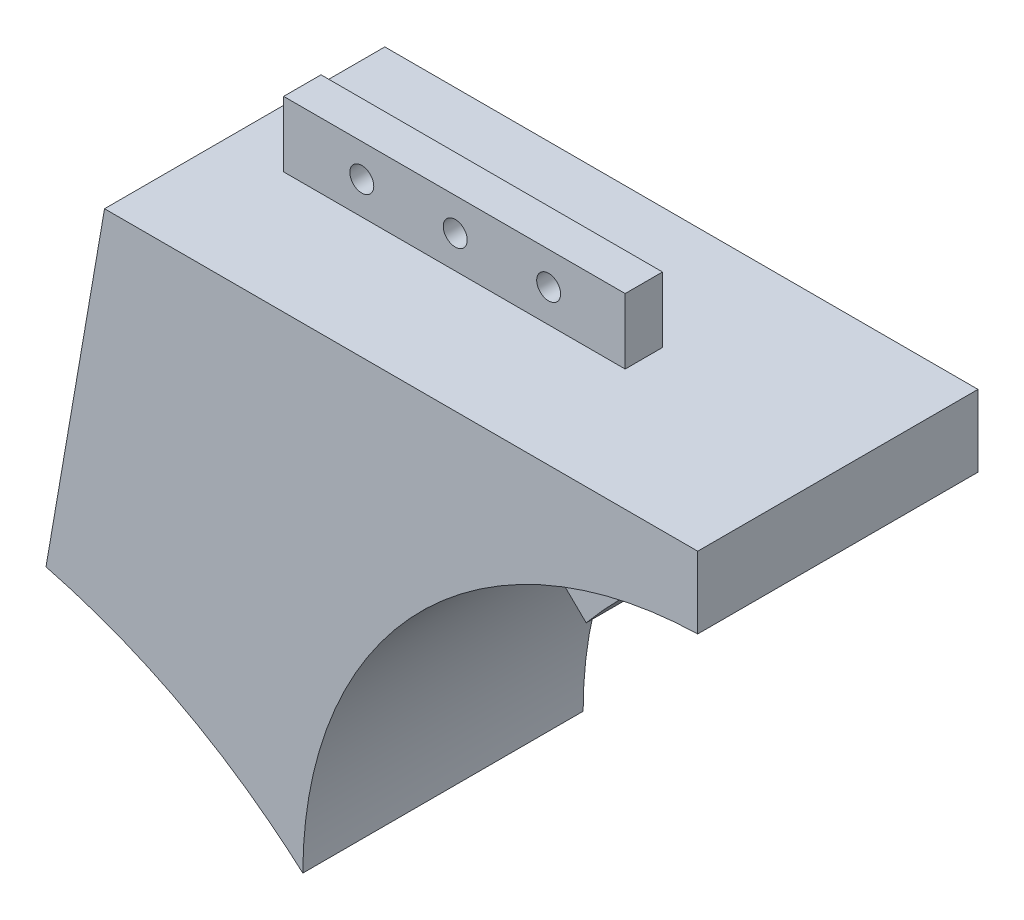
ISO-10303-21;
HEADER;
FILE_DESCRIPTION(('STEP AP214'),'2;1');
FILE_NAME('part.step','',(''),(''),'','','');
FILE_SCHEMA(('AUTOMOTIVE_DESIGN { 1 0 10303 214 1 1 1 1 }'));
ENDSEC;
DATA;
#1=APPLICATION_CONTEXT('core data for automotive mechanical design processes');
#2=APPLICATION_PROTOCOL_DEFINITION('international standard','automotive_design',2000,#1);
#3=PRODUCT_CONTEXT('',#1,'mechanical');
#4=PRODUCT('Part','Part','',(#3));
#5=PRODUCT_RELATED_PRODUCT_CATEGORY('part','',(#4));
#6=PRODUCT_DEFINITION_FORMATION('','',#4);
#7=PRODUCT_DEFINITION_CONTEXT('part definition',#1,'design');
#8=PRODUCT_DEFINITION('design','',#6,#7);
#9=PRODUCT_DEFINITION_SHAPE('','',#8);
#10=(LENGTH_UNIT() NAMED_UNIT(*) SI_UNIT(.MILLI.,.METRE.));
#11=(NAMED_UNIT(*) PLANE_ANGLE_UNIT() SI_UNIT($,.RADIAN.));
#12=(NAMED_UNIT(*) SI_UNIT($,.STERADIAN.) SOLID_ANGLE_UNIT());
#13=UNCERTAINTY_MEASURE_WITH_UNIT(LENGTH_MEASURE(1.E-05),#10,'distance_accuracy_value','');
#14=(GEOMETRIC_REPRESENTATION_CONTEXT(3) GLOBAL_UNCERTAINTY_ASSIGNED_CONTEXT((#13)) GLOBAL_UNIT_ASSIGNED_CONTEXT((#10,
#11,#12)) REPRESENTATION_CONTEXT('',''));
#15=CARTESIAN_POINT('',(0.,0.,0.));
#16=DIRECTION('',(0.,0.,1.));
#17=DIRECTION('',(1.,0.,0.));
#18=AXIS2_PLACEMENT_3D('',#15,#16,#17);
#19=CARTESIAN_POINT('',(0.,43.8748420001809,30.));
#20=DIRECTION('',(0.,-1.,0.));
#21=DIRECTION('',(0.,0.,-1.));
#22=AXIS2_PLACEMENT_3D('',#19,#20,#21);
#23=PLANE('',#22);
#24=DIRECTION('',(1.,0.,0.));
#25=VECTOR('',#24,1.);
#26=CARTESIAN_POINT('',(0.,43.8748420001809,-30.));
#27=LINE('',#26,#25);
#28=CARTESIAN_POINT('',(107.40504349076,43.8748420001809,-30.));
#29=VERTEX_POINT('',#28);
#30=CARTESIAN_POINT('',(234.383754042939,43.8748420001809,-30.));
#31=VERTEX_POINT('',#30);
#32=EDGE_CURVE('E272',#29,#31,#27,.T.);
#33=ORIENTED_EDGE('',*,*,#32,.F.);
#34=DIRECTION('',(0.,0.,-1.));
#35=VECTOR('',#34,1.);
#36=CARTESIAN_POINT('',(107.40504349076,43.8748420001809,30.));
#37=LINE('',#36,#35);
#38=CARTESIAN_POINT('',(107.40504349076,43.8748420001809,30.));
#39=VERTEX_POINT('',#38);
#40=EDGE_CURVE('E460',#39,#29,#37,.T.);
#41=ORIENTED_EDGE('',*,*,#40,.F.);
#42=DIRECTION('',(-1.,0.,0.));
#43=VECTOR('',#42,1.);
#44=CARTESIAN_POINT('',(0.,43.8748420001809,30.));
#45=LINE('',#44,#43);
#46=CARTESIAN_POINT('',(234.383754042939,43.8748420001809,30.));
#47=VERTEX_POINT('',#46);
#48=EDGE_CURVE('E458',#47,#39,#45,.T.);
#49=ORIENTED_EDGE('',*,*,#48,.F.);
#50=DIRECTION('',(0.,0.,-1.));
#51=VECTOR('',#50,1.);
#52=CARTESIAN_POINT('',(234.383754042939,43.8748420001809,30.));
#53=LINE('',#52,#51);
#54=EDGE_CURVE('E394',#47,#31,#53,.T.);
#55=ORIENTED_EDGE('',*,*,#54,.T.);
#56=EDGE_LOOP('',(#33,#41,#49,#55));
#57=FACE_BOUND('',#56,.T.);
#58=DIRECTION('',(0.,0.,-1.));
#59=VECTOR('',#58,1.);
#60=CARTESIAN_POINT('',(119.747446117063,43.8748420001809,4.));
#61=LINE('',#60,#59);
#62=CARTESIAN_POINT('',(119.747446117063,43.8748420001809,4.));
#63=VERTEX_POINT('',#62);
#64=CARTESIAN_POINT('',(119.747446117063,43.8748420001809,-4.));
#65=VERTEX_POINT('',#64);
#66=EDGE_CURVE('E61',#63,#65,#61,.T.);
#67=ORIENTED_EDGE('',*,*,#66,.T.);
#68=DIRECTION('',(1.,0.,0.));
#69=VECTOR('',#68,1.);
#70=CARTESIAN_POINT('',(0.,43.8748420001809,-4.));
#71=LINE('',#70,#69);
#72=CARTESIAN_POINT('',(192.853964769341,43.8748420001809,-4.));
#73=VERTEX_POINT('',#72);
#74=EDGE_CURVE('E243',#65,#73,#71,.T.);
#75=ORIENTED_EDGE('',*,*,#74,.T.);
#76=DIRECTION('',(0.,0.,-1.));
#77=VECTOR('',#76,1.);
#78=CARTESIAN_POINT('',(192.853964769341,43.8748420001809,4.));
#79=LINE('',#78,#77);
#80=CARTESIAN_POINT('',(192.853964769341,43.8748420001809,4.));
#81=VERTEX_POINT('',#80);
#82=EDGE_CURVE('E69',#81,#73,#79,.T.);
#83=ORIENTED_EDGE('',*,*,#82,.F.);
#84=DIRECTION('',(1.,0.,0.));
#85=VECTOR('',#84,1.);
#86=CARTESIAN_POINT('',(0.,43.8748420001809,4.));
#87=LINE('',#86,#85);
#88=EDGE_CURVE('E496',#63,#81,#87,.T.);
#89=ORIENTED_EDGE('',*,*,#88,.F.);
#90=EDGE_LOOP('',(#67,#75,#83,#89));
#91=FACE_BOUND('',#90,.T.);
#92=ADVANCED_FACE('F43',(#57,#91),#23,.F.);
#93=CARTESIAN_POINT('',(94.8747151035941,-28.7786924894815,30.));
#94=CARTESIAN_POINT('',(125.819297310027,-36.7658527288833,30.));
#95=CARTESIAN_POINT('',(149.85586451388,-58.0677160071102,30.));
#96=B_SPLINE_CURVE_WITH_KNOTS('',2,(#93,#94,#95),.UNSPECIFIED.,.F.,.F.,(3,3),(0.,1.),.UNSPECIFIED.);
#97=DIRECTION('',(0.,0.,-1.));
#98=VECTOR('',#97,1.);
#99=SURFACE_OF_LINEAR_EXTRUSION('',#96,#98);
#100=CARTESIAN_POINT('',(94.8747151035941,-28.7786924894815,-4.));
#101=CARTESIAN_POINT('',(125.819297310027,-36.7658527288833,-4.));
#102=CARTESIAN_POINT('',(149.85586451388,-58.0677160071102,-4.));
#103=B_SPLINE_CURVE_WITH_KNOTS('',2,(#100,#101,#102),.UNSPECIFIED.,.F.,.F.,(3,3),(0.,1.),.UNSPECIFIED.);
#104=CARTESIAN_POINT('',(101.184495320647,-30.5679295091444,-4.));
#105=VERTEX_POINT('',#104);
#106=CARTESIAN_POINT('',(149.85586451388,-58.0677160071102,-4.));
#107=VERTEX_POINT('',#106);
#108=EDGE_CURVE('E202',#105,#107,#103,.T.);
#109=ORIENTED_EDGE('',*,*,#108,.F.);
#110=DIRECTION('',(0.,0.,-1.));
#111=VECTOR('',#110,1.);
#112=CARTESIAN_POINT('',(101.184495320647,-30.5679295091444,4.));
#113=LINE('',#112,#111);
#114=CARTESIAN_POINT('',(101.184495320647,-30.5679295091442,4.));
#115=VERTEX_POINT('',#114);
#116=EDGE_CURVE('E322',#115,#105,#113,.T.);
#117=ORIENTED_EDGE('',*,*,#116,.F.);
#118=CARTESIAN_POINT('',(94.8747151035941,-28.7786924894815,4.));
#119=CARTESIAN_POINT('',(125.819297310027,-36.7658527288833,4.));
#120=CARTESIAN_POINT('',(149.85586451388,-58.0677160071102,4.));
#121=B_SPLINE_CURVE_WITH_KNOTS('',2,(#118,#119,#120),.UNSPECIFIED.,.F.,.F.,(3,3),(0.,1.),.UNSPECIFIED.);
#122=CARTESIAN_POINT('',(149.85586451388,-58.0677160071102,4.));
#123=VERTEX_POINT('',#122);
#124=EDGE_CURVE('E284',#115,#123,#121,.T.);
#125=ORIENTED_EDGE('',*,*,#124,.T.);
#126=DIRECTION('',(0.,0.,-1.));
#127=VECTOR('',#126,1.);
#128=CARTESIAN_POINT('',(149.85586451388,-58.0677160071102,30.));
#129=LINE('',#128,#127);
#130=CARTESIAN_POINT('',(149.85586451388,-58.0677160071102,30.));
#131=VERTEX_POINT('',#130);
#132=EDGE_CURVE('E53',#131,#123,#129,.T.);
#133=ORIENTED_EDGE('',*,*,#132,.F.);
#134=CARTESIAN_POINT('',(94.874715103594,-28.7786924894815,30.));
#135=VERTEX_POINT('',#134);
#136=EDGE_CURVE('E440',#135,#131,#96,.T.);
#137=ORIENTED_EDGE('',*,*,#136,.F.);
#138=DIRECTION('',(0.,0.,-1.));
#139=VECTOR('',#138,1.);
#140=CARTESIAN_POINT('',(94.874715103594,-28.7786924894815,30.));
#141=LINE('',#140,#139);
#142=CARTESIAN_POINT('',(94.874715103594,-28.7786924894815,-30.));
#143=VERTEX_POINT('',#142);
#144=EDGE_CURVE('E11',#135,#143,#141,.T.);
#145=ORIENTED_EDGE('',*,*,#144,.T.);
#146=CARTESIAN_POINT('',(94.8747151035941,-28.7786924894815,-30.));
#147=CARTESIAN_POINT('',(125.819297310027,-36.7658527288833,-30.));
#148=CARTESIAN_POINT('',(149.85586451388,-58.0677160071102,-30.));
#149=B_SPLINE_CURVE_WITH_KNOTS('',2,(#146,#147,#148),.UNSPECIFIED.,.F.,.F.,(3,3),(0.,1.),.UNSPECIFIED.);
#150=CARTESIAN_POINT('',(149.85586451388,-58.0677160071102,-30.));
#151=VERTEX_POINT('',#150);
#152=EDGE_CURVE('E256',#143,#151,#149,.T.);
#153=ORIENTED_EDGE('',*,*,#152,.T.);
#154=DIRECTION('',(0.,0.,1.));
#155=VECTOR('',#154,1.);
#156=CARTESIAN_POINT('',(149.85586451388,-58.0677160071102,-30.));
#157=LINE('',#156,#155);
#158=EDGE_CURVE('E280',#151,#107,#157,.T.);
#159=ORIENTED_EDGE('',*,*,#158,.T.);
#160=EDGE_LOOP('',(#109,#117,#125,#133,#137,#145,#153,#159));
#161=FACE_BOUND('',#160,.T.);
#162=ADVANCED_FACE('F366',(#161),#99,.F.);
#163=CARTESIAN_POINT('',(236.472275343207,-58.0677160071102,30.));
#164=DIRECTION('',(0.,0.,-1.));
#165=DIRECTION('',(-1.,0.,0.));
#166=AXIS2_PLACEMENT_3D('',#163,#164,#165);
#167=CYLINDRICAL_SURFACE('',#166,86.6164108293275);
#168=CARTESIAN_POINT('',(236.472275343207,-58.0677160071102,-4.));
#169=DIRECTION('',(0.,0.,1.));
#170=DIRECTION('',(1.,0.,0.));
#171=AXIS2_PLACEMENT_3D('',#168,#169,#170);
#172=CIRCLE('',#171,86.6164108293275);
#173=CARTESIAN_POINT('',(174.491218382533,2.43642602459283,-4.));
#174=VERTEX_POINT('',#173);
#175=CARTESIAN_POINT('',(234.383754042939,28.5235116301809,-4.));
#176=VERTEX_POINT('',#175);
#177=EDGE_CURVE('E181',#174,#176,#172,.F.);
#178=ORIENTED_EDGE('',*,*,#177,.F.);
#179=DIRECTION('',(0.,0.,-1.));
#180=VECTOR('',#179,1.);
#181=CARTESIAN_POINT('',(174.491218382533,2.43642602459283,4.));
#182=LINE('',#181,#180);
#183=CARTESIAN_POINT('',(174.491218382533,2.43642602459286,4.));
#184=VERTEX_POINT('',#183);
#185=EDGE_CURVE('E185',#184,#174,#182,.T.);
#186=ORIENTED_EDGE('',*,*,#185,.F.);
#187=CARTESIAN_POINT('',(236.472275343207,-58.0677160071102,4.));
#188=DIRECTION('',(0.,0.,1.));
#189=DIRECTION('',(1.,0.,0.));
#190=AXIS2_PLACEMENT_3D('',#187,#188,#189);
#191=CIRCLE('',#190,86.6164108293275);
#192=CARTESIAN_POINT('',(234.383754042939,28.5235116301809,4.));
#193=VERTEX_POINT('',#192);
#194=EDGE_CURVE('E345',#184,#193,#191,.F.);
#195=ORIENTED_EDGE('',*,*,#194,.T.);
#196=DIRECTION('',(0.,0.,-1.));
#197=VECTOR('',#196,1.);
#198=CARTESIAN_POINT('',(234.383754042939,28.5235116301809,30.));
#199=LINE('',#198,#197);
#200=CARTESIAN_POINT('',(234.383754042939,28.5235116301809,30.));
#201=VERTEX_POINT('',#200);
#202=EDGE_CURVE('E391',#201,#193,#199,.T.);
#203=ORIENTED_EDGE('',*,*,#202,.F.);
#204=CARTESIAN_POINT('',(236.472275343207,-58.0677160071102,30.));
#205=DIRECTION('',(0.,0.,1.));
#206=DIRECTION('',(1.,0.,0.));
#207=AXIS2_PLACEMENT_3D('',#204,#205,#206);
#208=CIRCLE('',#207,86.6164108293275);
#209=EDGE_CURVE('E404',#131,#201,#208,.F.);
#210=ORIENTED_EDGE('',*,*,#209,.F.);
#211=ORIENTED_EDGE('',*,*,#132,.T.);
#212=DIRECTION('',(0.,0.,-1.));
#213=VECTOR('',#212,1.);
#214=CARTESIAN_POINT('',(149.85586451388,-58.0677160071102,4.));
#215=LINE('',#214,#213);
#216=EDGE_CURVE('E313',#123,#107,#215,.T.);
#217=ORIENTED_EDGE('',*,*,#216,.T.);
#218=ORIENTED_EDGE('',*,*,#158,.F.);
#219=CARTESIAN_POINT('',(236.472275343207,-58.0677160071102,-30.));
#220=DIRECTION('',(0.,0.,1.));
#221=DIRECTION('',(1.,0.,0.));
#222=AXIS2_PLACEMENT_3D('',#219,#220,#221);
#223=CIRCLE('',#222,86.6164108293275);
#224=CARTESIAN_POINT('',(234.383754042939,28.5235116301809,-30.));
#225=VERTEX_POINT('',#224);
#226=EDGE_CURVE('E262',#151,#225,#223,.F.);
#227=ORIENTED_EDGE('',*,*,#226,.T.);
#228=DIRECTION('',(0.,0.,1.));
#229=VECTOR('',#228,1.);
#230=CARTESIAN_POINT('',(234.383754042939,28.5235116301809,-30.));
#231=LINE('',#230,#229);
#232=EDGE_CURVE('E281',#225,#176,#231,.T.);
#233=ORIENTED_EDGE('',*,*,#232,.T.);
#234=EDGE_LOOP('',(#178,#186,#195,#203,#210,#211,#217,#218,#227,#233));
#235=FACE_BOUND('',#234,.T.);
#236=ADVANCED_FACE('F370',(#235),#167,.F.);
#237=CARTESIAN_POINT('',(96.9542007058559,-16.7213884622832,30.));
#238=DIRECTION('',(0.985451355131345,-0.169957720241815,0.));
#239=DIRECTION('',(0.169957720241815,0.985451355131346,0.));
#240=AXIS2_PLACEMENT_3D('',#237,#238,#239);
#241=PLANE('',#240);
#242=ORIENTED_EDGE('',*,*,#40,.T.);
#243=DIRECTION('',(-0.169957720241815,-0.985451355131346,0.));
#244=VECTOR('',#243,1.);
#245=CARTESIAN_POINT('',(96.9542007058559,-16.7213884622832,-30.));
#246=LINE('',#245,#244);
#247=EDGE_CURVE('E276',#29,#143,#246,.T.);
#248=ORIENTED_EDGE('',*,*,#247,.T.);
#249=ORIENTED_EDGE('',*,*,#144,.F.);
#250=DIRECTION('',(-0.169957720241815,-0.985451355131346,0.));
#251=VECTOR('',#250,1.);
#252=CARTESIAN_POINT('',(96.9542007058559,-16.7213884622832,30.));
#253=LINE('',#252,#251);
#254=EDGE_CURVE('E447',#39,#135,#253,.T.);
#255=ORIENTED_EDGE('',*,*,#254,.F.);
#256=EDGE_LOOP('',(#242,#248,#249,#255));
#257=FACE_BOUND('',#256,.T.);
#258=ADVANCED_FACE('F45',(#257),#241,.F.);
#259=CARTESIAN_POINT('',(234.383754042939,0.,30.));
#260=DIRECTION('',(1.,0.,0.));
#261=DIRECTION('',(0.,0.,-1.));
#262=AXIS2_PLACEMENT_3D('',#259,#260,#261);
#263=PLANE('',#262);
#264=DIRECTION('',(0.,0.,-1.));
#265=VECTOR('',#264,1.);
#266=CARTESIAN_POINT('',(234.383754042939,28.5235116301809,4.));
#267=LINE('',#266,#265);
#268=EDGE_CURVE('E173',#193,#176,#267,.T.);
#269=ORIENTED_EDGE('',*,*,#268,.T.);
#270=ORIENTED_EDGE('',*,*,#232,.F.);
#271=DIRECTION('',(0.,-1.,0.));
#272=VECTOR('',#271,1.);
#273=CARTESIAN_POINT('',(234.383754042939,0.,-30.));
#274=LINE('',#273,#272);
#275=EDGE_CURVE('E269',#31,#225,#274,.T.);
#276=ORIENTED_EDGE('',*,*,#275,.F.);
#277=ORIENTED_EDGE('',*,*,#54,.F.);
#278=DIRECTION('',(0.,-1.,0.));
#279=VECTOR('',#278,1.);
#280=CARTESIAN_POINT('',(234.383754042939,0.,30.));
#281=LINE('',#280,#279);
#282=EDGE_CURVE('E454',#47,#201,#281,.T.);
#283=ORIENTED_EDGE('',*,*,#282,.T.);
#284=ORIENTED_EDGE('',*,*,#202,.T.);
#285=EDGE_LOOP('',(#269,#270,#276,#277,#283,#284));
#286=FACE_BOUND('',#285,.T.);
#287=ADVANCED_FACE('F380',(#286),#263,.T.);
#288=CARTESIAN_POINT('',(0.,0.,30.));
#289=DIRECTION('',(0.,0.,1.));
#290=DIRECTION('',(1.,0.,0.));
#291=AXIS2_PLACEMENT_3D('',#288,#289,#290);
#292=PLANE('',#291);
#293=ORIENTED_EDGE('',*,*,#254,.T.);
#294=ORIENTED_EDGE('',*,*,#136,.T.);
#295=ORIENTED_EDGE('',*,*,#209,.T.);
#296=ORIENTED_EDGE('',*,*,#282,.F.);
#297=ORIENTED_EDGE('',*,*,#48,.T.);
#298=EDGE_LOOP('',(#293,#294,#295,#296,#297));
#299=FACE_BOUND('',#298,.T.);
#300=ADVANCED_FACE('F434',(#299),#292,.T.);
#301=CARTESIAN_POINT('',(192.853964769341,0.,4.));
#302=DIRECTION('',(-1.,0.,0.));
#303=DIRECTION('',(0.,0.,1.));
#304=AXIS2_PLACEMENT_3D('',#301,#302,#303);
#305=PLANE('',#304);
#306=ORIENTED_EDGE('',*,*,#82,.T.);
#307=DIRECTION('',(0.,1.,0.));
#308=VECTOR('',#307,1.);
#309=CARTESIAN_POINT('',(192.853964769341,0.,-4.));
#310=LINE('',#309,#308);
#311=CARTESIAN_POINT('',(192.853964769341,57.8748420001809,-4.));
#312=VERTEX_POINT('',#311);
#313=EDGE_CURVE('E246',#73,#312,#310,.T.);
#314=ORIENTED_EDGE('',*,*,#313,.T.);
#315=DIRECTION('',(0.,0.,-1.));
#316=VECTOR('',#315,1.);
#317=CARTESIAN_POINT('',(192.853964769341,57.8748420001809,4.));
#318=LINE('',#317,#316);
#319=CARTESIAN_POINT('',(192.853964769341,57.8748420001809,4.));
#320=VERTEX_POINT('',#319);
#321=EDGE_CURVE('E475',#320,#312,#318,.T.);
#322=ORIENTED_EDGE('',*,*,#321,.F.);
#323=DIRECTION('',(0.,1.,0.));
#324=VECTOR('',#323,1.);
#325=CARTESIAN_POINT('',(192.853964769341,0.,4.));
#326=LINE('',#325,#324);
#327=EDGE_CURVE('E493',#81,#320,#326,.T.);
#328=ORIENTED_EDGE('',*,*,#327,.F.);
#329=EDGE_LOOP('',(#306,#314,#322,#328));
#330=FACE_BOUND('',#329,.T.);
#331=ADVANCED_FACE('F532',(#330),#305,.F.);
#332=CARTESIAN_POINT('',(0.,57.8748420001809,4.));
#333=DIRECTION('',(0.,1.,0.));
#334=DIRECTION('',(0.,0.,1.));
#335=AXIS2_PLACEMENT_3D('',#332,#333,#334);
#336=PLANE('',#335);
#337=ORIENTED_EDGE('',*,*,#321,.T.);
#338=DIRECTION('',(1.,0.,0.));
#339=VECTOR('',#338,1.);
#340=CARTESIAN_POINT('',(0.,57.8748420001809,-4.));
#341=LINE('',#340,#339);
#342=CARTESIAN_POINT('',(119.747446117063,57.8748420001809,-4.));
#343=VERTEX_POINT('',#342);
#344=EDGE_CURVE('E248',#343,#312,#341,.T.);
#345=ORIENTED_EDGE('',*,*,#344,.F.);
#346=DIRECTION('',(0.,0.,-1.));
#347=VECTOR('',#346,1.);
#348=CARTESIAN_POINT('',(119.747446117063,57.8748420001809,4.));
#349=LINE('',#348,#347);
#350=CARTESIAN_POINT('',(119.747446117063,57.8748420001809,4.));
#351=VERTEX_POINT('',#350);
#352=EDGE_CURVE('E479',#351,#343,#349,.T.);
#353=ORIENTED_EDGE('',*,*,#352,.F.);
#354=DIRECTION('',(1.,0.,0.));
#355=VECTOR('',#354,1.);
#356=CARTESIAN_POINT('',(0.,57.8748420001809,4.));
#357=LINE('',#356,#355);
#358=EDGE_CURVE('E489',#351,#320,#357,.T.);
#359=ORIENTED_EDGE('',*,*,#358,.T.);
#360=EDGE_LOOP('',(#337,#345,#353,#359));
#361=FACE_BOUND('',#360,.T.);
#362=ADVANCED_FACE('F534',(#361),#336,.T.);
#363=CARTESIAN_POINT('',(136.475208859533,50.8748420001809,4.));
#364=DIRECTION('',(0.,0.,-1.));
#365=DIRECTION('',(-1.,0.,0.));
#366=AXIS2_PLACEMENT_3D('',#363,#364,#365);
#367=CYLINDRICAL_SURFACE('',#366,2.5625);
#368=CARTESIAN_POINT('',(136.475208859533,50.8748420001809,4.));
#369=DIRECTION('',(0.,0.,1.));
#370=DIRECTION('',(1.,0.,0.));
#371=AXIS2_PLACEMENT_3D('',#368,#369,#370);
#372=CIRCLE('',#371,2.5625);
#373=CARTESIAN_POINT('',(139.037708859533,50.8748420001809,4.));
#374=VERTEX_POINT('',#373);
#375=EDGE_CURVE('E499',#374,#374,#372,.T.);
#376=ORIENTED_EDGE('',*,*,#375,.T.);
#377=EDGE_LOOP('',(#376));
#378=FACE_BOUND('',#377,.T.);
#379=CARTESIAN_POINT('',(136.475208859533,50.8748420001809,-4.));
#380=DIRECTION('',(0.,0.,1.));
#381=DIRECTION('',(1.,0.,0.));
#382=AXIS2_PLACEMENT_3D('',#379,#380,#381);
#383=CIRCLE('',#382,2.5625);
#384=CARTESIAN_POINT('',(139.037708859533,50.8748420001809,-4.));
#385=VERTEX_POINT('',#384);
#386=EDGE_CURVE('E239',#385,#385,#383,.T.);
#387=ORIENTED_EDGE('',*,*,#386,.F.);
#388=EDGE_LOOP('',(#387));
#389=FACE_BOUND('',#388,.T.);
#390=ADVANCED_FACE('F546',(#378,#389),#367,.F.);
#391=CARTESIAN_POINT('',(156.475208859533,50.8748420001809,4.));
#392=DIRECTION('',(0.,0.,-1.));
#393=DIRECTION('',(-1.,0.,0.));
#394=AXIS2_PLACEMENT_3D('',#391,#392,#393);
#395=CYLINDRICAL_SURFACE('',#394,2.5625);
#396=CARTESIAN_POINT('',(156.475208859533,50.8748420001809,4.));
#397=DIRECTION('',(0.,0.,1.));
#398=DIRECTION('',(1.,0.,0.));
#399=AXIS2_PLACEMENT_3D('',#396,#397,#398);
#400=CIRCLE('',#399,2.5625);
#401=CARTESIAN_POINT('',(159.037708859533,50.8748420001809,4.));
#402=VERTEX_POINT('',#401);
#403=EDGE_CURVE('E503',#402,#402,#400,.T.);
#404=ORIENTED_EDGE('',*,*,#403,.T.);
#405=EDGE_LOOP('',(#404));
#406=FACE_BOUND('',#405,.T.);
#407=CARTESIAN_POINT('',(156.475208859533,50.8748420001809,-4.));
#408=DIRECTION('',(0.,0.,1.));
#409=DIRECTION('',(1.,0.,0.));
#410=AXIS2_PLACEMENT_3D('',#407,#408,#409);
#411=CIRCLE('',#410,2.5625);
#412=CARTESIAN_POINT('',(159.037708859533,50.8748420001809,-4.));
#413=VERTEX_POINT('',#412);
#414=EDGE_CURVE('E235',#413,#413,#411,.T.);
#415=ORIENTED_EDGE('',*,*,#414,.F.);
#416=EDGE_LOOP('',(#415));
#417=FACE_BOUND('',#416,.T.);
#418=ADVANCED_FACE('F541',(#406,#417),#395,.F.);
#419=CARTESIAN_POINT('',(176.475208859533,50.8748420001809,4.));
#420=DIRECTION('',(0.,0.,-1.));
#421=DIRECTION('',(-1.,0.,0.));
#422=AXIS2_PLACEMENT_3D('',#419,#420,#421);
#423=CYLINDRICAL_SURFACE('',#422,2.5625);
#424=CARTESIAN_POINT('',(176.475208859533,50.8748420001809,4.));
#425=DIRECTION('',(0.,0.,1.));
#426=DIRECTION('',(1.,0.,0.));
#427=AXIS2_PLACEMENT_3D('',#424,#425,#426);
#428=CIRCLE('',#427,2.5625);
#429=CARTESIAN_POINT('',(179.037708859533,50.8748420001809,4.));
#430=VERTEX_POINT('',#429);
#431=EDGE_CURVE('E172',#430,#430,#428,.T.);
#432=ORIENTED_EDGE('',*,*,#431,.T.);
#433=EDGE_LOOP('',(#432));
#434=FACE_BOUND('',#433,.T.);
#435=CARTESIAN_POINT('',(176.475208859533,50.8748420001809,-4.));
#436=DIRECTION('',(0.,0.,1.));
#437=DIRECTION('',(1.,0.,0.));
#438=AXIS2_PLACEMENT_3D('',#435,#436,#437);
#439=CIRCLE('',#438,2.5625);
#440=CARTESIAN_POINT('',(179.037708859533,50.8748420001809,-4.));
#441=VERTEX_POINT('',#440);
#442=EDGE_CURVE('E231',#441,#441,#439,.T.);
#443=ORIENTED_EDGE('',*,*,#442,.F.);
#444=EDGE_LOOP('',(#443));
#445=FACE_BOUND('',#444,.T.);
#446=ADVANCED_FACE('F512',(#434,#445),#423,.F.);
#447=CARTESIAN_POINT('',(119.747446117063,0.,4.));
#448=DIRECTION('',(-1.,0.,0.));
#449=DIRECTION('',(0.,0.,1.));
#450=AXIS2_PLACEMENT_3D('',#447,#448,#449);
#451=PLANE('',#450);
#452=ORIENTED_EDGE('',*,*,#352,.T.);
#453=DIRECTION('',(0.,1.,0.));
#454=VECTOR('',#453,1.);
#455=CARTESIAN_POINT('',(119.747446117063,0.,-4.));
#456=LINE('',#455,#454);
#457=EDGE_CURVE('E252',#65,#343,#456,.T.);
#458=ORIENTED_EDGE('',*,*,#457,.F.);
#459=ORIENTED_EDGE('',*,*,#66,.F.);
#460=DIRECTION('',(0.,1.,0.));
#461=VECTOR('',#460,1.);
#462=CARTESIAN_POINT('',(119.747446117063,0.,4.));
#463=LINE('',#462,#461);
#464=EDGE_CURVE('E485',#63,#351,#463,.T.);
#465=ORIENTED_EDGE('',*,*,#464,.T.);
#466=EDGE_LOOP('',(#452,#458,#459,#465));
#467=FACE_BOUND('',#466,.T.);
#468=ADVANCED_FACE('F518',(#467),#451,.T.);
#469=CARTESIAN_POINT('',(0.,0.,4.));
#470=DIRECTION('',(0.,0.,1.));
#471=DIRECTION('',(1.,0.,0.));
#472=AXIS2_PLACEMENT_3D('',#469,#470,#471);
#473=PLANE('',#472);
#474=ORIENTED_EDGE('',*,*,#431,.F.);
#475=EDGE_LOOP('',(#474));
#476=FACE_BOUND('',#475,.T.);
#477=ORIENTED_EDGE('',*,*,#403,.F.);
#478=EDGE_LOOP('',(#477));
#479=FACE_BOUND('',#478,.T.);
#480=ORIENTED_EDGE('',*,*,#375,.F.);
#481=EDGE_LOOP('',(#480));
#482=FACE_BOUND('',#481,.T.);
#483=ORIENTED_EDGE('',*,*,#88,.T.);
#484=ORIENTED_EDGE('',*,*,#327,.T.);
#485=ORIENTED_EDGE('',*,*,#358,.F.);
#486=ORIENTED_EDGE('',*,*,#464,.F.);
#487=EDGE_LOOP('',(#483,#484,#485,#486));
#488=FACE_BOUND('',#487,.T.);
#489=ADVANCED_FACE('F515',(#476,#479,#482,#488),#473,.T.);
#490=CARTESIAN_POINT('',(86.3597752926117,88.4678299994357,4.));
#491=DIRECTION('',(0.69852977573641,0.715580989413246,0.));
#492=DIRECTION('',(-0.715580989413246,0.69852977573641,0.));
#493=AXIS2_PLACEMENT_3D('',#490,#491,#492);
#494=PLANE('',#493);
#495=ORIENTED_EDGE('',*,*,#185,.T.);
#496=DIRECTION('',(0.715580989413246,-0.69852977573641,0.));
#497=VECTOR('',#496,1.);
#498=CARTESIAN_POINT('',(86.3597752926117,88.4678299994357,-4.));
#499=LINE('',#498,#497);
#500=CARTESIAN_POINT('',(184.509352234318,-7.34299083571688,-4.));
#501=VERTEX_POINT('',#500);
#502=EDGE_CURVE('E179',#174,#501,#499,.T.);
#503=ORIENTED_EDGE('',*,*,#502,.T.);
#504=DIRECTION('',(0.,0.,-1.));
#505=VECTOR('',#504,1.);
#506=CARTESIAN_POINT('',(184.509352234318,-7.34299083571688,4.));
#507=LINE('',#506,#505);
#508=CARTESIAN_POINT('',(184.509352234318,-7.34299083571688,4.));
#509=VERTEX_POINT('',#508);
#510=EDGE_CURVE('E159',#509,#501,#507,.T.);
#511=ORIENTED_EDGE('',*,*,#510,.F.);
#512=DIRECTION('',(0.715580989413246,-0.69852977573641,0.));
#513=VECTOR('',#512,1.);
#514=CARTESIAN_POINT('',(86.3597752926117,88.4678299994357,4.));
#515=LINE('',#514,#513);
#516=EDGE_CURVE('E327',#184,#509,#515,.T.);
#517=ORIENTED_EDGE('',*,*,#516,.F.);
#518=EDGE_LOOP('',(#495,#503,#511,#517));
#519=FACE_BOUND('',#518,.T.);
#520=ADVANCED_FACE('F184',(#519),#494,.F.);
#521=CARTESIAN_POINT('',(184.509352234318,-7.34299083571691,4.));
#522=CARTESIAN_POINT('',(204.930565052323,17.0782269509427,4.));
#523=CARTESIAN_POINT('',(234.383754042939,28.5235116301809,4.));
#524=B_SPLINE_CURVE_WITH_KNOTS('',2,(#521,#522,#523),.UNSPECIFIED.,.F.,.F.,(3,3),(0.,1.),.UNSPECIFIED.);
#525=DIRECTION('',(0.,0.,-1.));
#526=VECTOR('',#525,1.);
#527=SURFACE_OF_LINEAR_EXTRUSION('',#524,#526);
#528=ORIENTED_EDGE('',*,*,#510,.T.);
#529=CARTESIAN_POINT('',(184.509352234318,-7.34299083571691,-4.));
#530=CARTESIAN_POINT('',(204.930565052323,17.0782269509427,-4.));
#531=CARTESIAN_POINT('',(234.383754042939,28.5235116301809,-4.));
#532=B_SPLINE_CURVE_WITH_KNOTS('',2,(#529,#530,#531),.UNSPECIFIED.,.F.,.F.,(3,3),(0.,1.),.UNSPECIFIED.);
#533=EDGE_CURVE('E163',#501,#176,#532,.T.);
#534=ORIENTED_EDGE('',*,*,#533,.T.);
#535=ORIENTED_EDGE('',*,*,#268,.F.);
#536=EDGE_CURVE('E166',#509,#193,#524,.T.);
#537=ORIENTED_EDGE('',*,*,#536,.F.);
#538=EDGE_LOOP('',(#528,#534,#535,#537));
#539=FACE_BOUND('',#538,.T.);
#540=ADVANCED_FACE('F161',(#539),#527,.F.);
#541=CARTESIAN_POINT('',(185.507321809779,3.70038673266233,4.));
#542=DIRECTION('',(0.,0.,-1.));
#543=DIRECTION('',(-1.,0.,0.));
#544=AXIS2_PLACEMENT_3D('',#541,#542,#543);
#545=CYLINDRICAL_SURFACE('',#544,2.56300000000001);
#546=CARTESIAN_POINT('',(185.507321809779,3.70038673266233,4.));
#547=DIRECTION('',(0.,0.,1.));
#548=DIRECTION('',(1.,0.,0.));
#549=AXIS2_PLACEMENT_3D('',#546,#547,#548);
#550=CIRCLE('',#549,2.56300000000001);
#551=CARTESIAN_POINT('',(188.070321809779,3.70038673266233,4.));
#552=VERTEX_POINT('',#551);
#553=EDGE_CURVE('E323',#552,#552,#550,.T.);
#554=ORIENTED_EDGE('',*,*,#553,.T.);
#555=EDGE_LOOP('',(#554));
#556=FACE_BOUND('',#555,.T.);
#557=CARTESIAN_POINT('',(185.507321809779,3.70038673266233,-4.));
#558=DIRECTION('',(0.,0.,1.));
#559=DIRECTION('',(1.,0.,0.));
#560=AXIS2_PLACEMENT_3D('',#557,#558,#559);
#561=CIRCLE('',#560,2.56300000000001);
#562=CARTESIAN_POINT('',(188.070321809779,3.70038673266233,-4.));
#563=VERTEX_POINT('',#562);
#564=EDGE_CURVE('E187',#563,#563,#561,.T.);
#565=ORIENTED_EDGE('',*,*,#564,.F.);
#566=EDGE_LOOP('',(#565));
#567=FACE_BOUND('',#566,.T.);
#568=ADVANCED_FACE('F661',(#556,#567),#545,.F.);
#569=CARTESIAN_POINT('',(0.,0.,4.));
#570=DIRECTION('',(0.,0.,1.));
#571=DIRECTION('',(1.,0.,0.));
#572=AXIS2_PLACEMENT_3D('',#569,#570,#571);
#573=PLANE('',#572);
#574=ORIENTED_EDGE('',*,*,#553,.F.);
#575=EDGE_LOOP('',(#574));
#576=FACE_BOUND('',#575,.T.);
#577=ORIENTED_EDGE('',*,*,#516,.T.);
#578=ORIENTED_EDGE('',*,*,#536,.T.);
#579=ORIENTED_EDGE('',*,*,#194,.F.);
#580=EDGE_LOOP('',(#577,#578,#579));
#581=FACE_BOUND('',#580,.T.);
#582=ADVANCED_FACE('F386',(#576,#581),#573,.T.);
#583=CARTESIAN_POINT('',(100.969554421848,-31.2621394124562,4.));
#584=DIRECTION('',(0.955260076823207,-0.295767113837425,0.));
#585=DIRECTION('',(0.295767113837425,0.955260076823207,0.));
#586=AXIS2_PLACEMENT_3D('',#583,#584,#585);
#587=PLANE('',#586);
#588=ORIENTED_EDGE('',*,*,#116,.T.);
#589=DIRECTION('',(-0.295767113837425,-0.955260076823207,0.));
#590=VECTOR('',#589,1.);
#591=CARTESIAN_POINT('',(100.969554421848,-31.2621394124562,-4.));
#592=LINE('',#591,#590);
#593=CARTESIAN_POINT('',(97.3202825554329,-43.0484522253679,-4.));
#594=VERTEX_POINT('',#593);
#595=EDGE_CURVE('E208',#105,#594,#592,.T.);
#596=ORIENTED_EDGE('',*,*,#595,.T.);
#597=DIRECTION('',(0.,0.,-1.));
#598=VECTOR('',#597,1.);
#599=CARTESIAN_POINT('',(97.3202825554329,-43.0484522253679,4.));
#600=LINE('',#599,#598);
#601=CARTESIAN_POINT('',(97.3202825554329,-43.0484522253679,4.));
#602=VERTEX_POINT('',#601);
#603=EDGE_CURVE('E319',#602,#594,#600,.T.);
#604=ORIENTED_EDGE('',*,*,#603,.F.);
#605=DIRECTION('',(-0.295767113837425,-0.955260076823207,0.));
#606=VECTOR('',#605,1.);
#607=CARTESIAN_POINT('',(100.969554421848,-31.2621394124562,4.));
#608=LINE('',#607,#606);
#609=EDGE_CURVE('E292',#115,#602,#608,.T.);
#610=ORIENTED_EDGE('',*,*,#609,.F.);
#611=EDGE_LOOP('',(#588,#596,#604,#610));
#612=FACE_BOUND('',#611,.T.);
#613=ADVANCED_FACE('F356',(#612),#587,.F.);
#614=CARTESIAN_POINT('',(0.598407833092139,1.30495339984236,4.));
#615=DIRECTION('',(0.416829807653801,0.908984549621882,0.));
#616=DIRECTION('',(-0.908984549621882,0.416829807653801,0.));
#617=AXIS2_PLACEMENT_3D('',#614,#615,#616);
#618=PLANE('',#617);
#619=ORIENTED_EDGE('',*,*,#603,.T.);
#620=DIRECTION('',(0.908984549621882,-0.416829807653801,0.));
#621=VECTOR('',#620,1.);
#622=CARTESIAN_POINT('',(0.598407833092139,1.30495339984236,-4.));
#623=LINE('',#622,#621);
#624=CARTESIAN_POINT('',(130.072927576534,-58.0677160071096,-4.));
#625=VERTEX_POINT('',#624);
#626=EDGE_CURVE('E215',#594,#625,#623,.T.);
#627=ORIENTED_EDGE('',*,*,#626,.T.);
#628=DIRECTION('',(0.,0.,-1.));
#629=VECTOR('',#628,1.);
#630=CARTESIAN_POINT('',(130.072927576534,-58.0677160071096,4.));
#631=LINE('',#630,#629);
#632=CARTESIAN_POINT('',(130.072927576534,-58.0677160071096,4.));
#633=VERTEX_POINT('',#632);
#634=EDGE_CURVE('E316',#633,#625,#631,.T.);
#635=ORIENTED_EDGE('',*,*,#634,.F.);
#636=DIRECTION('',(0.908984549621882,-0.416829807653801,0.));
#637=VECTOR('',#636,1.);
#638=CARTESIAN_POINT('',(0.598407833092139,1.30495339984236,4.));
#639=LINE('',#638,#637);
#640=EDGE_CURVE('E298',#602,#633,#639,.T.);
#641=ORIENTED_EDGE('',*,*,#640,.F.);
#642=EDGE_LOOP('',(#619,#627,#635,#641));
#643=FACE_BOUND('',#642,.T.);
#644=ADVANCED_FACE('F414',(#643),#618,.F.);
#645=CARTESIAN_POINT('',(128.167744083728,-49.4931618278407,4.));
#646=DIRECTION('',(0.,0.,-1.));
#647=DIRECTION('',(-1.,0.,0.));
#648=AXIS2_PLACEMENT_3D('',#645,#646,#647);
#649=CYLINDRICAL_SURFACE('',#648,2.56249999999685);
#650=CARTESIAN_POINT('',(128.167744083728,-49.4931618278407,4.));
#651=DIRECTION('',(0.,0.,1.));
#652=DIRECTION('',(1.,0.,0.));
#653=AXIS2_PLACEMENT_3D('',#650,#651,#652);
#654=CIRCLE('',#653,2.56249999999685);
#655=CARTESIAN_POINT('',(130.730244083724,-49.4931618278407,4.));
#656=VERTEX_POINT('',#655);
#657=EDGE_CURVE('E305',#656,#656,#654,.T.);
#658=ORIENTED_EDGE('',*,*,#657,.T.);
#659=EDGE_LOOP('',(#658));
#660=FACE_BOUND('',#659,.T.);
#661=CARTESIAN_POINT('',(128.167744083728,-49.4931618278408,-4.));
#662=DIRECTION('',(0.,0.,1.));
#663=DIRECTION('',(1.,0.,0.));
#664=AXIS2_PLACEMENT_3D('',#661,#662,#663);
#665=CIRCLE('',#664,2.56249999999675);
#666=CARTESIAN_POINT('',(130.730244083724,-49.4931618278408,-4.));
#667=VERTEX_POINT('',#666);
#668=EDGE_CURVE('E223',#667,#667,#665,.T.);
#669=ORIENTED_EDGE('',*,*,#668,.F.);
#670=EDGE_LOOP('',(#669));
#671=FACE_BOUND('',#670,.T.);
#672=ADVANCED_FACE('F416',(#660,#671),#649,.F.);
#673=CARTESIAN_POINT('',(-1.81269289025964E-12,-58.0677160071055,4.));
#674=DIRECTION('',(0.,1.,0.));
#675=DIRECTION('',(-1.,0.,0.));
#676=AXIS2_PLACEMENT_3D('',#673,#674,#675);
#677=PLANE('',#676);
#678=ORIENTED_EDGE('',*,*,#634,.T.);
#679=DIRECTION('',(1.,0.,0.));
#680=VECTOR('',#679,1.);
#681=CARTESIAN_POINT('',(-1.81269289025964E-12,-58.0677160071055,-4.));
#682=LINE('',#681,#680);
#683=EDGE_CURVE('E219',#625,#107,#682,.T.);
#684=ORIENTED_EDGE('',*,*,#683,.T.);
#685=ORIENTED_EDGE('',*,*,#216,.F.);
#686=DIRECTION('',(1.,0.,0.));
#687=VECTOR('',#686,1.);
#688=CARTESIAN_POINT('',(-1.81269289025964E-12,-58.0677160071055,4.));
#689=LINE('',#688,#687);
#690=EDGE_CURVE('E301',#633,#123,#689,.T.);
#691=ORIENTED_EDGE('',*,*,#690,.F.);
#692=EDGE_LOOP('',(#678,#684,#685,#691));
#693=FACE_BOUND('',#692,.T.);
#694=ADVANCED_FACE('F412',(#693),#677,.F.);
#695=CARTESIAN_POINT('',(109.079068541668,-40.7397358671106,4.));
#696=DIRECTION('',(0.,0.,-1.));
#697=DIRECTION('',(-1.,0.,0.));
#698=AXIS2_PLACEMENT_3D('',#695,#696,#697);
#699=CYLINDRICAL_SURFACE('',#698,2.56249999999661);
#700=CARTESIAN_POINT('',(109.079068541668,-40.7397358671106,4.));
#701=DIRECTION('',(0.,0.,1.));
#702=DIRECTION('',(1.,0.,0.));
#703=AXIS2_PLACEMENT_3D('',#700,#701,#702);
#704=CIRCLE('',#703,2.56249999999661);
#705=CARTESIAN_POINT('',(111.641568541665,-40.7397358671106,4.));
#706=VERTEX_POINT('',#705);
#707=EDGE_CURVE('E309',#706,#706,#704,.T.);
#708=ORIENTED_EDGE('',*,*,#707,.T.);
#709=EDGE_LOOP('',(#708));
#710=FACE_BOUND('',#709,.T.);
#711=CARTESIAN_POINT('',(109.079068541668,-40.7397358671106,-4.));
#712=DIRECTION('',(0.,0.,1.));
#713=DIRECTION('',(1.,0.,0.));
#714=AXIS2_PLACEMENT_3D('',#711,#712,#713);
#715=CIRCLE('',#714,2.56249999999653);
#716=CARTESIAN_POINT('',(111.641568541665,-40.7397358671106,-4.));
#717=VERTEX_POINT('',#716);
#718=EDGE_CURVE('E227',#717,#717,#715,.T.);
#719=ORIENTED_EDGE('',*,*,#718,.F.);
#720=EDGE_LOOP('',(#719));
#721=FACE_BOUND('',#720,.T.);
#722=ADVANCED_FACE('F575',(#710,#721),#699,.F.);
#723=CARTESIAN_POINT('',(0.,0.,4.));
#724=DIRECTION('',(0.,0.,1.));
#725=DIRECTION('',(1.,0.,0.));
#726=AXIS2_PLACEMENT_3D('',#723,#724,#725);
#727=PLANE('',#726);
#728=ORIENTED_EDGE('',*,*,#124,.F.);
#729=ORIENTED_EDGE('',*,*,#609,.T.);
#730=ORIENTED_EDGE('',*,*,#640,.T.);
#731=ORIENTED_EDGE('',*,*,#690,.T.);
#732=EDGE_LOOP('',(#728,#729,#730,#731));
#733=FACE_BOUND('',#732,.T.);
#734=ORIENTED_EDGE('',*,*,#657,.F.);
#735=EDGE_LOOP('',(#734));
#736=FACE_BOUND('',#735,.T.);
#737=ORIENTED_EDGE('',*,*,#707,.F.);
#738=EDGE_LOOP('',(#737));
#739=FACE_BOUND('',#738,.T.);
#740=ADVANCED_FACE('F407',(#733,#736,#739),#727,.T.);
#741=CARTESIAN_POINT('',(0.,0.,-30.));
#742=DIRECTION('',(0.,0.,1.));
#743=DIRECTION('',(1.,0.,0.));
#744=AXIS2_PLACEMENT_3D('',#741,#742,#743);
#745=PLANE('',#744);
#746=ORIENTED_EDGE('',*,*,#152,.F.);
#747=ORIENTED_EDGE('',*,*,#247,.F.);
#748=ORIENTED_EDGE('',*,*,#32,.T.);
#749=ORIENTED_EDGE('',*,*,#275,.T.);
#750=ORIENTED_EDGE('',*,*,#226,.F.);
#751=EDGE_LOOP('',(#746,#747,#748,#749,#750));
#752=FACE_BOUND('',#751,.T.);
#753=ADVANCED_FACE('F374',(#752),#745,.F.);
#754=CARTESIAN_POINT('',(0.,0.,-4.));
#755=DIRECTION('',(0.,0.,1.));
#756=DIRECTION('',(1.,0.,0.));
#757=AXIS2_PLACEMENT_3D('',#754,#755,#756);
#758=PLANE('',#757);
#759=ORIENTED_EDGE('',*,*,#442,.T.);
#760=EDGE_LOOP('',(#759));
#761=FACE_BOUND('',#760,.T.);
#762=ORIENTED_EDGE('',*,*,#414,.T.);
#763=EDGE_LOOP('',(#762));
#764=FACE_BOUND('',#763,.T.);
#765=ORIENTED_EDGE('',*,*,#386,.T.);
#766=EDGE_LOOP('',(#765));
#767=FACE_BOUND('',#766,.T.);
#768=ORIENTED_EDGE('',*,*,#74,.F.);
#769=ORIENTED_EDGE('',*,*,#457,.T.);
#770=ORIENTED_EDGE('',*,*,#344,.T.);
#771=ORIENTED_EDGE('',*,*,#313,.F.);
#772=EDGE_LOOP('',(#768,#769,#770,#771));
#773=FACE_BOUND('',#772,.T.);
#774=ADVANCED_FACE('F530',(#761,#764,#767,#773),#758,.F.);
#775=CARTESIAN_POINT('',(0.,0.,-4.));
#776=DIRECTION('',(0.,0.,1.));
#777=DIRECTION('',(1.,0.,0.));
#778=AXIS2_PLACEMENT_3D('',#775,#776,#777);
#779=PLANE('',#778);
#780=ORIENTED_EDGE('',*,*,#108,.T.);
#781=ORIENTED_EDGE('',*,*,#683,.F.);
#782=ORIENTED_EDGE('',*,*,#626,.F.);
#783=ORIENTED_EDGE('',*,*,#595,.F.);
#784=EDGE_LOOP('',(#780,#781,#782,#783));
#785=FACE_BOUND('',#784,.T.);
#786=ORIENTED_EDGE('',*,*,#668,.T.);
#787=EDGE_LOOP('',(#786));
#788=FACE_BOUND('',#787,.T.);
#789=ORIENTED_EDGE('',*,*,#718,.T.);
#790=EDGE_LOOP('',(#789));
#791=FACE_BOUND('',#790,.T.);
#792=ADVANCED_FACE('F363',(#785,#788,#791),#779,.F.);
#793=CARTESIAN_POINT('',(0.,0.,-4.));
#794=DIRECTION('',(0.,0.,1.));
#795=DIRECTION('',(1.,0.,0.));
#796=AXIS2_PLACEMENT_3D('',#793,#794,#795);
#797=PLANE('',#796);
#798=ORIENTED_EDGE('',*,*,#564,.T.);
#799=EDGE_LOOP('',(#798));
#800=FACE_BOUND('',#799,.T.);
#801=ORIENTED_EDGE('',*,*,#502,.F.);
#802=ORIENTED_EDGE('',*,*,#177,.T.);
#803=ORIENTED_EDGE('',*,*,#533,.F.);
#804=EDGE_LOOP('',(#801,#802,#803));
#805=FACE_BOUND('',#804,.T.);
#806=ADVANCED_FACE('F178',(#800,#805),#797,.F.);
#807=CLOSED_SHELL('',(#92,#162,#236,#258,#287,#300,#331,#362,#390,#418,#446,#468,#489,#520,#540,
#568,#582,#613,#644,#672,#694,#722,#740,#753,#774,#792,#806));
#808=MANIFOLD_SOLID_BREP('B2',#807);
#809=ADVANCED_BREP_SHAPE_REPRESENTATION('',(#18,#808),#14);
#810=SHAPE_DEFINITION_REPRESENTATION(#9,#809);
ENDSEC;
END-ISO-10303-21;
